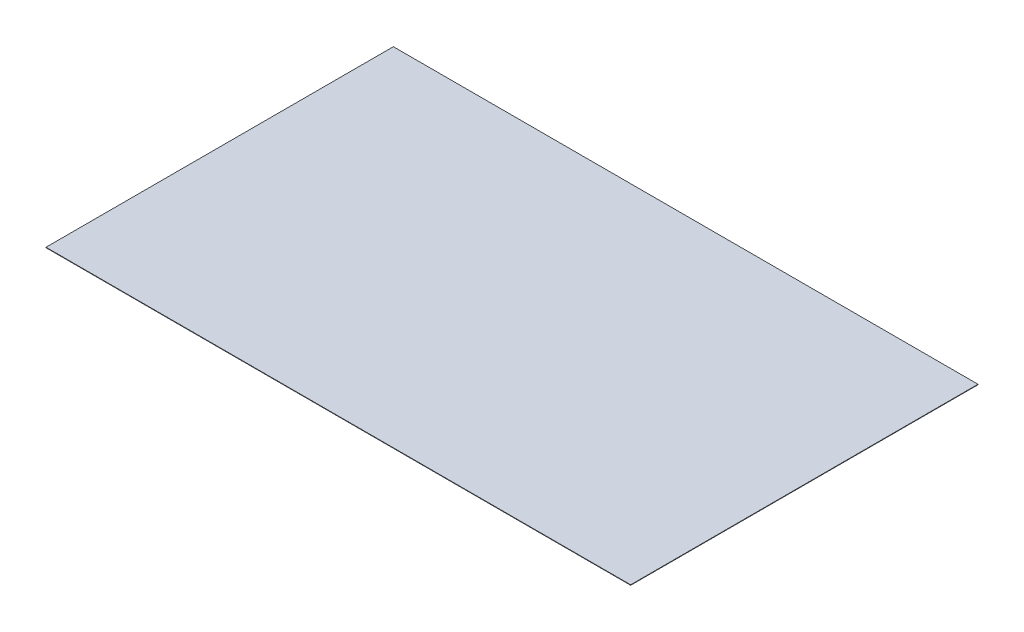
ISO-10303-21;
HEADER;
FILE_DESCRIPTION(('STEP AP214'),'2;1');
FILE_NAME('part.step','',(''),(''),'','','');
FILE_SCHEMA(('AUTOMOTIVE_DESIGN { 1 0 10303 214 1 1 1 1 }'));
ENDSEC;
DATA;
#1=APPLICATION_CONTEXT('core data for automotive mechanical design processes');
#2=APPLICATION_PROTOCOL_DEFINITION('international standard','automotive_design',2000,#1);
#3=PRODUCT_CONTEXT('',#1,'mechanical');
#4=PRODUCT('Part','Part','',(#3));
#5=PRODUCT_RELATED_PRODUCT_CATEGORY('part','',(#4));
#6=PRODUCT_DEFINITION_FORMATION('','',#4);
#7=PRODUCT_DEFINITION_CONTEXT('part definition',#1,'design');
#8=PRODUCT_DEFINITION('design','',#6,#7);
#9=PRODUCT_DEFINITION_SHAPE('','',#8);
#10=(LENGTH_UNIT() NAMED_UNIT(*) SI_UNIT(.MILLI.,.METRE.));
#11=(NAMED_UNIT(*) PLANE_ANGLE_UNIT() SI_UNIT($,.RADIAN.));
#12=(NAMED_UNIT(*) SI_UNIT($,.STERADIAN.) SOLID_ANGLE_UNIT());
#13=UNCERTAINTY_MEASURE_WITH_UNIT(LENGTH_MEASURE(1.E-05),#10,'distance_accuracy_value','');
#14=(GEOMETRIC_REPRESENTATION_CONTEXT(3) GLOBAL_UNCERTAINTY_ASSIGNED_CONTEXT((#13)) GLOBAL_UNIT_ASSIGNED_CONTEXT((#10,
#11,#12)) REPRESENTATION_CONTEXT('',''));
#15=CARTESIAN_POINT('',(0.,0.,0.));
#16=DIRECTION('',(0.,0.,1.));
#17=DIRECTION('',(1.,0.,0.));
#18=AXIS2_PLACEMENT_3D('',#15,#16,#17);
#19=CARTESIAN_POINT('',(62.5,765.,-757.5));
#20=DIRECTION('',(-1.,0.,0.));
#21=DIRECTION('',(0.,0.,1.));
#22=AXIS2_PLACEMENT_3D('',#19,#20,#21);
#23=PLANE('',#22);
#24=DIRECTION('',(0.,-1.,0.));
#25=VECTOR('',#24,1.);
#26=CARTESIAN_POINT('',(62.5,765.,0.));
#27=LINE('',#26,#25);
#28=CARTESIAN_POINT('',(62.5,766.,0.));
#29=VERTEX_POINT('',#28);
#30=CARTESIAN_POINT('',(62.5,765.,0.));
#31=VERTEX_POINT('',#30);
#32=EDGE_CURVE('E103',#29,#31,#27,.T.);
#33=ORIENTED_EDGE('',*,*,#32,.F.);
#34=DIRECTION('',(0.,0.,1.));
#35=VECTOR('',#34,1.);
#36=CARTESIAN_POINT('',(62.5,766.,-757.5));
#37=LINE('',#36,#35);
#38=CARTESIAN_POINT('',(62.5,766.,-757.5));
#39=VERTEX_POINT('',#38);
#40=EDGE_CURVE('E11',#39,#29,#37,.T.);
#41=ORIENTED_EDGE('',*,*,#40,.F.);
#42=DIRECTION('',(0.,-1.,0.));
#43=VECTOR('',#42,1.);
#44=CARTESIAN_POINT('',(62.5,765.,-757.5));
#45=LINE('',#44,#43);
#46=CARTESIAN_POINT('',(62.5,765.,-757.5));
#47=VERTEX_POINT('',#46);
#48=EDGE_CURVE('E97',#39,#47,#45,.T.);
#49=ORIENTED_EDGE('',*,*,#48,.T.);
#50=DIRECTION('',(0.,0.,1.));
#51=VECTOR('',#50,1.);
#52=CARTESIAN_POINT('',(62.5,765.,-757.5));
#53=LINE('',#52,#51);
#54=EDGE_CURVE('E42',#47,#31,#53,.T.);
#55=ORIENTED_EDGE('',*,*,#54,.T.);
#56=EDGE_LOOP('',(#33,#41,#49,#55));
#57=FACE_BOUND('',#56,.T.);
#58=ADVANCED_FACE('F39',(#57),#23,.T.);
#59=CARTESIAN_POINT('',(62.5,766.,-757.5));
#60=DIRECTION('',(0.,1.,0.));
#61=DIRECTION('',(0.,0.,1.));
#62=AXIS2_PLACEMENT_3D('',#59,#60,#61);
#63=PLANE('',#62);
#64=DIRECTION('',(-1.,0.,0.));
#65=VECTOR('',#64,1.);
#66=CARTESIAN_POINT('',(62.5,766.,0.));
#67=LINE('',#66,#65);
#68=CARTESIAN_POINT('',(1337.5,766.,0.));
#69=VERTEX_POINT('',#68);
#70=EDGE_CURVE('E99',#69,#29,#67,.T.);
#71=ORIENTED_EDGE('',*,*,#70,.F.);
#72=DIRECTION('',(0.,0.,1.));
#73=VECTOR('',#72,1.);
#74=CARTESIAN_POINT('',(1337.5,766.,-757.5));
#75=LINE('',#74,#73);
#76=CARTESIAN_POINT('',(1337.5,766.,-757.5));
#77=VERTEX_POINT('',#76);
#78=EDGE_CURVE('E48',#77,#69,#75,.T.);
#79=ORIENTED_EDGE('',*,*,#78,.F.);
#80=DIRECTION('',(-1.,0.,0.));
#81=VECTOR('',#80,1.);
#82=CARTESIAN_POINT('',(62.5,766.,-757.5));
#83=LINE('',#82,#81);
#84=EDGE_CURVE('E94',#77,#39,#83,.T.);
#85=ORIENTED_EDGE('',*,*,#84,.T.);
#86=ORIENTED_EDGE('',*,*,#40,.T.);
#87=EDGE_LOOP('',(#71,#79,#85,#86));
#88=FACE_BOUND('',#87,.T.);
#89=ADVANCED_FACE('F113',(#88),#63,.T.);
#90=CARTESIAN_POINT('',(1337.5,765.,-757.5));
#91=DIRECTION('',(1.,0.,0.));
#92=DIRECTION('',(0.,0.,-1.));
#93=AXIS2_PLACEMENT_3D('',#90,#91,#92);
#94=PLANE('',#93);
#95=DIRECTION('',(0.,1.,0.));
#96=VECTOR('',#95,1.);
#97=CARTESIAN_POINT('',(1337.5,765.,0.));
#98=LINE('',#97,#96);
#99=CARTESIAN_POINT('',(1337.5,765.,0.));
#100=VERTEX_POINT('',#99);
#101=EDGE_CURVE('E89',#100,#69,#98,.T.);
#102=ORIENTED_EDGE('',*,*,#101,.F.);
#103=DIRECTION('',(0.,0.,1.));
#104=VECTOR('',#103,1.);
#105=CARTESIAN_POINT('',(1337.5,765.,-757.5));
#106=LINE('',#105,#104);
#107=CARTESIAN_POINT('',(1337.5,765.,-757.5));
#108=VERTEX_POINT('',#107);
#109=EDGE_CURVE('E84',#108,#100,#106,.T.);
#110=ORIENTED_EDGE('',*,*,#109,.F.);
#111=DIRECTION('',(0.,1.,0.));
#112=VECTOR('',#111,1.);
#113=CARTESIAN_POINT('',(1337.5,765.,-757.5));
#114=LINE('',#113,#112);
#115=EDGE_CURVE('E87',#108,#77,#114,.T.);
#116=ORIENTED_EDGE('',*,*,#115,.T.);
#117=ORIENTED_EDGE('',*,*,#78,.T.);
#118=EDGE_LOOP('',(#102,#110,#116,#117));
#119=FACE_BOUND('',#118,.T.);
#120=ADVANCED_FACE('F86',(#119),#94,.T.);
#121=CARTESIAN_POINT('',(62.5,765.,-757.5));
#122=DIRECTION('',(0.,-1.,0.));
#123=DIRECTION('',(0.,0.,-1.));
#124=AXIS2_PLACEMENT_3D('',#121,#122,#123);
#125=PLANE('',#124);
#126=DIRECTION('',(1.,0.,0.));
#127=VECTOR('',#126,1.);
#128=CARTESIAN_POINT('',(62.5,765.,0.));
#129=LINE('',#128,#127);
#130=EDGE_CURVE('E106',#31,#100,#129,.T.);
#131=ORIENTED_EDGE('',*,*,#130,.F.);
#132=ORIENTED_EDGE('',*,*,#54,.F.);
#133=DIRECTION('',(1.,0.,0.));
#134=VECTOR('',#133,1.);
#135=CARTESIAN_POINT('',(62.5,765.,-757.5));
#136=LINE('',#135,#134);
#137=EDGE_CURVE('E93',#47,#108,#136,.T.);
#138=ORIENTED_EDGE('',*,*,#137,.T.);
#139=ORIENTED_EDGE('',*,*,#109,.T.);
#140=EDGE_LOOP('',(#131,#132,#138,#139));
#141=FACE_BOUND('',#140,.T.);
#142=ADVANCED_FACE('F96',(#141),#125,.T.);
#143=CARTESIAN_POINT('',(0.,0.,-757.5));
#144=DIRECTION('',(0.,0.,-1.));
#145=DIRECTION('',(-1.,0.,0.));
#146=AXIS2_PLACEMENT_3D('',#143,#144,#145);
#147=PLANE('',#146);
#148=ORIENTED_EDGE('',*,*,#48,.F.);
#149=ORIENTED_EDGE('',*,*,#84,.F.);
#150=ORIENTED_EDGE('',*,*,#115,.F.);
#151=ORIENTED_EDGE('',*,*,#137,.F.);
#152=EDGE_LOOP('',(#148,#149,#150,#151));
#153=FACE_BOUND('',#152,.T.);
#154=ADVANCED_FACE('F92',(#153),#147,.T.);
#155=CARTESIAN_POINT('',(0.,0.,0.));
#156=DIRECTION('',(0.,0.,-1.));
#157=DIRECTION('',(-1.,0.,0.));
#158=AXIS2_PLACEMENT_3D('',#155,#156,#157);
#159=PLANE('',#158);
#160=ORIENTED_EDGE('',*,*,#32,.T.);
#161=ORIENTED_EDGE('',*,*,#130,.T.);
#162=ORIENTED_EDGE('',*,*,#101,.T.);
#163=ORIENTED_EDGE('',*,*,#70,.T.);
#164=EDGE_LOOP('',(#160,#161,#162,#163));
#165=FACE_BOUND('',#164,.T.);
#166=ADVANCED_FACE('F112',(#165),#159,.F.);
#167=CLOSED_SHELL('',(#58,#89,#120,#142,#154,#166));
#168=MANIFOLD_SOLID_BREP('B2',#167);
#169=ADVANCED_BREP_SHAPE_REPRESENTATION('',(#18,#168),#14);
#170=SHAPE_DEFINITION_REPRESENTATION(#9,#169);
ENDSEC;
END-ISO-10303-21;
